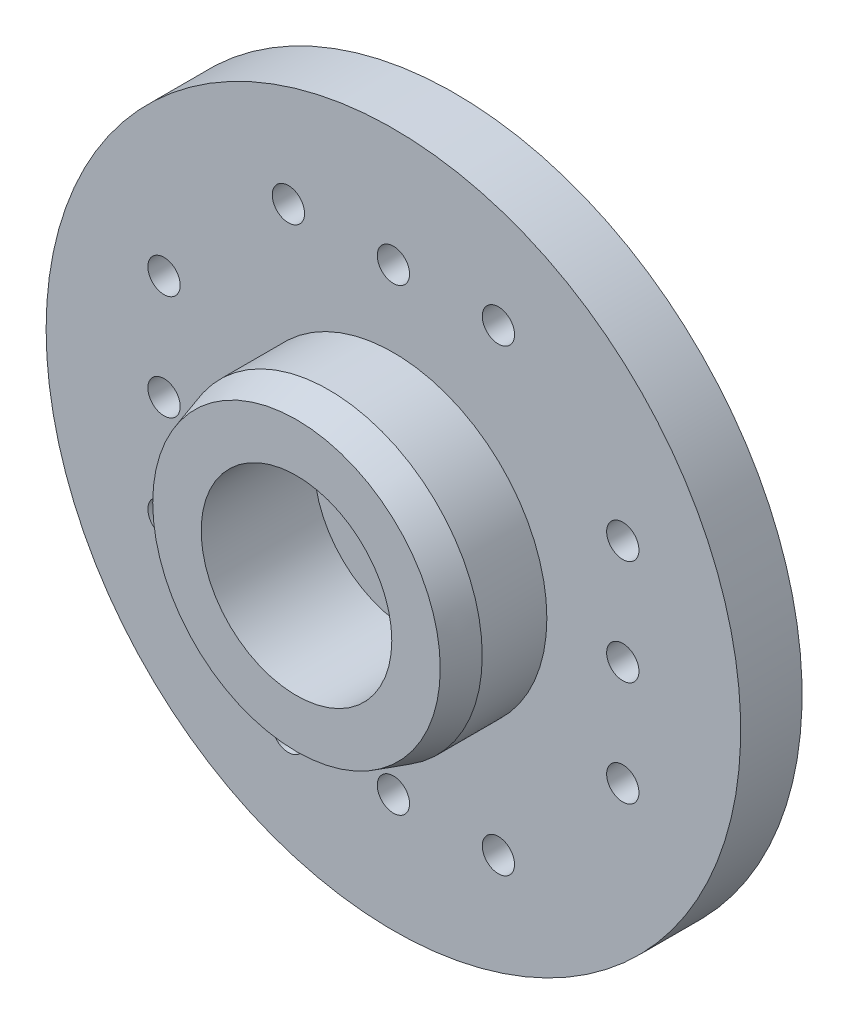
ISO-10303-21;
HEADER;
FILE_DESCRIPTION(('STEP AP214'),'2;1');
FILE_NAME('part.step','',(''),(''),'','','');
FILE_SCHEMA(('AUTOMOTIVE_DESIGN { 1 0 10303 214 1 1 1 1 }'));
ENDSEC;
DATA;
#1=APPLICATION_CONTEXT('core data for automotive mechanical design processes');
#2=APPLICATION_PROTOCOL_DEFINITION('international standard','automotive_design',2000,#1);
#3=PRODUCT_CONTEXT('',#1,'mechanical');
#4=PRODUCT('Part','Part','',(#3));
#5=PRODUCT_RELATED_PRODUCT_CATEGORY('part','',(#4));
#6=PRODUCT_DEFINITION_FORMATION('','',#4);
#7=PRODUCT_DEFINITION_CONTEXT('part definition',#1,'design');
#8=PRODUCT_DEFINITION('design','',#6,#7);
#9=PRODUCT_DEFINITION_SHAPE('','',#8);
#10=(LENGTH_UNIT() NAMED_UNIT(*) SI_UNIT(.MILLI.,.METRE.));
#11=(NAMED_UNIT(*) PLANE_ANGLE_UNIT() SI_UNIT($,.RADIAN.));
#12=(NAMED_UNIT(*) SI_UNIT($,.STERADIAN.) SOLID_ANGLE_UNIT());
#13=UNCERTAINTY_MEASURE_WITH_UNIT(LENGTH_MEASURE(1.E-05),#10,'distance_accuracy_value','');
#14=(GEOMETRIC_REPRESENTATION_CONTEXT(3) GLOBAL_UNCERTAINTY_ASSIGNED_CONTEXT((#13)) GLOBAL_UNIT_ASSIGNED_CONTEXT((#10,
#11,#12)) REPRESENTATION_CONTEXT('',''));
#15=CARTESIAN_POINT('',(0.,0.,0.));
#16=DIRECTION('',(0.,0.,1.));
#17=DIRECTION('',(1.,0.,0.));
#18=AXIS2_PLACEMENT_3D('',#15,#16,#17);
#19=CARTESIAN_POINT('',(0.,0.,0.));
#20=DIRECTION('',(0.,0.,1.));
#21=DIRECTION('',(1.,0.,0.));
#22=AXIS2_PLACEMENT_3D('',#19,#20,#21);
#23=PLANE('',#22);
#24=CARTESIAN_POINT('',(0.,0.,0.));
#25=DIRECTION('',(0.,0.,-1.));
#26=DIRECTION('',(-1.,0.,0.));
#27=AXIS2_PLACEMENT_3D('',#24,#25,#26);
#28=CIRCLE('',#27,4.25);
#29=CARTESIAN_POINT('',(-4.25,0.,0.));
#30=VERTEX_POINT('',#29);
#31=EDGE_CURVE('E142',#30,#30,#28,.T.);
#32=ORIENTED_EDGE('',*,*,#31,.F.);
#33=EDGE_LOOP('',(#32));
#34=FACE_BOUND('',#33,.T.);
#35=CARTESIAN_POINT('',(-7.09999999999931,-5.14309428378815E-13,0.));
#36=DIRECTION('',(0.,0.,1.));
#37=DIRECTION('',(1.,0.,0.));
#38=AXIS2_PLACEMENT_3D('',#35,#36,#37);
#39=CIRCLE('',#38,0.500000000000001);
#40=CARTESIAN_POINT('',(-6.5999999999993,-5.14309428378815E-13,0.));
#41=VERTEX_POINT('',#40);
#42=EDGE_CURVE('E106',#41,#41,#39,.T.);
#43=ORIENTED_EDGE('',*,*,#42,.T.);
#44=EDGE_LOOP('',(#43));
#45=FACE_BOUND('',#44,.T.);
#46=CARTESIAN_POINT('',(-3.24999999999879,-7.09999999999982,0.));
#47=DIRECTION('',(0.,0.,1.));
#48=DIRECTION('',(1.,0.,0.));
#49=AXIS2_PLACEMENT_3D('',#46,#47,#48);
#50=CIRCLE('',#49,0.5);
#51=CARTESIAN_POINT('',(-2.74999999999879,-7.09999999999982,0.));
#52=VERTEX_POINT('',#51);
#53=EDGE_CURVE('E94',#52,#52,#50,.T.);
#54=ORIENTED_EDGE('',*,*,#53,.T.);
#55=EDGE_LOOP('',(#54));
#56=FACE_BOUND('',#55,.T.);
#57=CARTESIAN_POINT('',(3.25000000000121,-7.09999999999982,0.));
#58=DIRECTION('',(0.,0.,1.));
#59=DIRECTION('',(1.,0.,0.));
#60=AXIS2_PLACEMENT_3D('',#57,#58,#59);
#61=CIRCLE('',#60,0.5);
#62=CARTESIAN_POINT('',(3.75000000000121,-7.09999999999982,0.));
#63=VERTEX_POINT('',#62);
#64=EDGE_CURVE('E82',#63,#63,#61,.T.);
#65=ORIENTED_EDGE('',*,*,#64,.T.);
#66=EDGE_LOOP('',(#65));
#67=FACE_BOUND('',#66,.T.);
#68=CARTESIAN_POINT('',(7.10000000000051,6.95585894128985E-13,0.));
#69=DIRECTION('',(0.,0.,1.));
#70=DIRECTION('',(1.,0.,0.));
#71=AXIS2_PLACEMENT_3D('',#68,#69,#70);
#72=CIRCLE('',#71,0.5);
#73=CARTESIAN_POINT('',(7.60000000000051,6.95585894128985E-13,0.));
#74=VERTEX_POINT('',#73);
#75=EDGE_CURVE('E70',#74,#74,#72,.T.);
#76=ORIENTED_EDGE('',*,*,#75,.T.);
#77=EDGE_LOOP('',(#76));
#78=FACE_BOUND('',#77,.T.);
#79=CARTESIAN_POINT('',(3.25,7.1,0.));
#80=DIRECTION('',(0.,0.,1.));
#81=DIRECTION('',(1.,0.,0.));
#82=AXIS2_PLACEMENT_3D('',#79,#80,#81);
#83=CIRCLE('',#82,0.5);
#84=CARTESIAN_POINT('',(3.75,7.1,0.));
#85=VERTEX_POINT('',#84);
#86=EDGE_CURVE('E58',#85,#85,#83,.T.);
#87=ORIENTED_EDGE('',*,*,#86,.T.);
#88=EDGE_LOOP('',(#87));
#89=FACE_BOUND('',#88,.T.);
#90=CARTESIAN_POINT('',(-3.25,7.1,0.));
#91=DIRECTION('',(0.,0.,1.));
#92=DIRECTION('',(1.,0.,0.));
#93=AXIS2_PLACEMENT_3D('',#90,#91,#92);
#94=CIRCLE('',#93,0.5);
#95=CARTESIAN_POINT('',(-2.75,7.1,0.));
#96=VERTEX_POINT('',#95);
#97=EDGE_CURVE('E46',#96,#96,#94,.T.);
#98=ORIENTED_EDGE('',*,*,#97,.T.);
#99=EDGE_LOOP('',(#98));
#100=FACE_BOUND('',#99,.T.);
#101=CARTESIAN_POINT('',(0.,0.,0.));
#102=DIRECTION('',(0.,0.,1.));
#103=DIRECTION('',(1.,0.,0.));
#104=AXIS2_PLACEMENT_3D('',#101,#102,#103);
#105=CIRCLE('',#104,10.75);
#106=CARTESIAN_POINT('',(-10.75,0.,0.));
#107=VERTEX_POINT('',#106);
#108=EDGE_CURVE('E37',#107,#107,#105,.T.);
#109=ORIENTED_EDGE('',*,*,#108,.F.);
#110=EDGE_LOOP('',(#109));
#111=FACE_BOUND('',#110,.T.);
#112=CARTESIAN_POINT('',(0.,7.1,0.));
#113=DIRECTION('',(0.,0.,1.));
#114=DIRECTION('',(1.,0.,0.));
#115=AXIS2_PLACEMENT_3D('',#112,#113,#114);
#116=CIRCLE('',#115,0.5);
#117=CARTESIAN_POINT('',(0.5,7.1,0.));
#118=VERTEX_POINT('',#117);
#119=EDGE_CURVE('E52',#118,#118,#116,.T.);
#120=ORIENTED_EDGE('',*,*,#119,.T.);
#121=EDGE_LOOP('',(#120));
#122=FACE_BOUND('',#121,.T.);
#123=CARTESIAN_POINT('',(7.10000000000051,3.2500000000007,0.));
#124=DIRECTION('',(0.,0.,1.));
#125=DIRECTION('',(1.,0.,0.));
#126=AXIS2_PLACEMENT_3D('',#123,#124,#125);
#127=CIRCLE('',#126,0.500000000000001);
#128=CARTESIAN_POINT('',(7.60000000000051,3.2500000000007,0.));
#129=VERTEX_POINT('',#128);
#130=EDGE_CURVE('E64',#129,#129,#127,.T.);
#131=ORIENTED_EDGE('',*,*,#130,.T.);
#132=EDGE_LOOP('',(#131));
#133=FACE_BOUND('',#132,.T.);
#134=CARTESIAN_POINT('',(7.10000000000051,-3.2499999999993,0.));
#135=DIRECTION('',(0.,0.,1.));
#136=DIRECTION('',(1.,0.,0.));
#137=AXIS2_PLACEMENT_3D('',#134,#135,#136);
#138=CIRCLE('',#137,0.5);
#139=CARTESIAN_POINT('',(7.60000000000051,-3.2499999999993,0.));
#140=VERTEX_POINT('',#139);
#141=EDGE_CURVE('E76',#140,#140,#138,.T.);
#142=ORIENTED_EDGE('',*,*,#141,.T.);
#143=EDGE_LOOP('',(#142));
#144=FACE_BOUND('',#143,.T.);
#145=CARTESIAN_POINT('',(1.20902582328041E-12,-7.09999999999982,0.));
#146=DIRECTION('',(0.,0.,1.));
#147=DIRECTION('',(1.,0.,0.));
#148=AXIS2_PLACEMENT_3D('',#145,#146,#147);
#149=CIRCLE('',#148,0.5);
#150=CARTESIAN_POINT('',(0.500000000001209,-7.09999999999982,0.));
#151=VERTEX_POINT('',#150);
#152=EDGE_CURVE('E88',#151,#151,#149,.T.);
#153=ORIENTED_EDGE('',*,*,#152,.T.);
#154=EDGE_LOOP('',(#153));
#155=FACE_BOUND('',#154,.T.);
#156=CARTESIAN_POINT('',(-7.0999999999993,-3.25000000000051,0.));
#157=DIRECTION('',(0.,0.,1.));
#158=DIRECTION('',(1.,0.,0.));
#159=AXIS2_PLACEMENT_3D('',#156,#157,#158);
#160=CIRCLE('',#159,0.5);
#161=CARTESIAN_POINT('',(-6.5999999999993,-3.25000000000051,0.));
#162=VERTEX_POINT('',#161);
#163=EDGE_CURVE('E100',#162,#162,#160,.T.);
#164=ORIENTED_EDGE('',*,*,#163,.T.);
#165=EDGE_LOOP('',(#164));
#166=FACE_BOUND('',#165,.T.);
#167=CARTESIAN_POINT('',(-7.09999999999931,3.24999999999949,0.));
#168=DIRECTION('',(0.,0.,1.));
#169=DIRECTION('',(1.,0.,0.));
#170=AXIS2_PLACEMENT_3D('',#167,#168,#169);
#171=CIRCLE('',#170,0.500000000000001);
#172=CARTESIAN_POINT('',(-6.59999999999931,3.24999999999949,0.));
#173=VERTEX_POINT('',#172);
#174=EDGE_CURVE('E112',#173,#173,#171,.T.);
#175=ORIENTED_EDGE('',*,*,#174,.T.);
#176=EDGE_LOOP('',(#175));
#177=FACE_BOUND('',#176,.T.);
#178=ADVANCED_FACE('F33',(#34,#45,#56,#67,#78,#89,#100,#111,#122,#133,#144,#155,#166,#177),#23,.F.);
#179=CARTESIAN_POINT('',(0.,0.,1.9));
#180=DIRECTION('',(0.,0.,1.));
#181=DIRECTION('',(1.,0.,0.));
#182=AXIS2_PLACEMENT_3D('',#179,#180,#181);
#183=PLANE('',#182);
#184=CARTESIAN_POINT('',(-7.09999999999931,3.24999999999949,1.9));
#185=DIRECTION('',(0.,0.,1.));
#186=DIRECTION('',(1.,0.,0.));
#187=AXIS2_PLACEMENT_3D('',#184,#185,#186);
#188=CIRCLE('',#187,0.500000000000001);
#189=CARTESIAN_POINT('',(-6.59999999999931,3.24999999999949,1.9));
#190=VERTEX_POINT('',#189);
#191=EDGE_CURVE('E109',#190,#190,#188,.T.);
#192=ORIENTED_EDGE('',*,*,#191,.F.);
#193=EDGE_LOOP('',(#192));
#194=FACE_BOUND('',#193,.T.);
#195=CARTESIAN_POINT('',(-7.0999999999993,-3.25000000000051,1.9));
#196=DIRECTION('',(0.,0.,1.));
#197=DIRECTION('',(1.,0.,0.));
#198=AXIS2_PLACEMENT_3D('',#195,#196,#197);
#199=CIRCLE('',#198,0.5);
#200=CARTESIAN_POINT('',(-6.5999999999993,-3.25000000000051,1.9));
#201=VERTEX_POINT('',#200);
#202=EDGE_CURVE('E97',#201,#201,#199,.T.);
#203=ORIENTED_EDGE('',*,*,#202,.F.);
#204=EDGE_LOOP('',(#203));
#205=FACE_BOUND('',#204,.T.);
#206=CARTESIAN_POINT('',(1.20902582328041E-12,-7.09999999999982,1.9));
#207=DIRECTION('',(0.,0.,1.));
#208=DIRECTION('',(1.,0.,0.));
#209=AXIS2_PLACEMENT_3D('',#206,#207,#208);
#210=CIRCLE('',#209,0.5);
#211=CARTESIAN_POINT('',(0.500000000001209,-7.09999999999982,1.9));
#212=VERTEX_POINT('',#211);
#213=EDGE_CURVE('E85',#212,#212,#210,.T.);
#214=ORIENTED_EDGE('',*,*,#213,.F.);
#215=EDGE_LOOP('',(#214));
#216=FACE_BOUND('',#215,.T.);
#217=CARTESIAN_POINT('',(7.10000000000051,-3.2499999999993,1.9));
#218=DIRECTION('',(0.,0.,1.));
#219=DIRECTION('',(1.,0.,0.));
#220=AXIS2_PLACEMENT_3D('',#217,#218,#219);
#221=CIRCLE('',#220,0.5);
#222=CARTESIAN_POINT('',(7.60000000000051,-3.2499999999993,1.9));
#223=VERTEX_POINT('',#222);
#224=EDGE_CURVE('E73',#223,#223,#221,.T.);
#225=ORIENTED_EDGE('',*,*,#224,.F.);
#226=EDGE_LOOP('',(#225));
#227=FACE_BOUND('',#226,.T.);
#228=CARTESIAN_POINT('',(7.10000000000051,3.2500000000007,1.9));
#229=DIRECTION('',(0.,0.,1.));
#230=DIRECTION('',(1.,0.,0.));
#231=AXIS2_PLACEMENT_3D('',#228,#229,#230);
#232=CIRCLE('',#231,0.500000000000001);
#233=CARTESIAN_POINT('',(7.60000000000051,3.2500000000007,1.9));
#234=VERTEX_POINT('',#233);
#235=EDGE_CURVE('E61',#234,#234,#232,.T.);
#236=ORIENTED_EDGE('',*,*,#235,.F.);
#237=EDGE_LOOP('',(#236));
#238=FACE_BOUND('',#237,.T.);
#239=CARTESIAN_POINT('',(0.,7.1,1.9));
#240=DIRECTION('',(0.,0.,1.));
#241=DIRECTION('',(1.,0.,0.));
#242=AXIS2_PLACEMENT_3D('',#239,#240,#241);
#243=CIRCLE('',#242,0.5);
#244=CARTESIAN_POINT('',(0.5,7.1,1.9));
#245=VERTEX_POINT('',#244);
#246=EDGE_CURVE('E49',#245,#245,#243,.T.);
#247=ORIENTED_EDGE('',*,*,#246,.F.);
#248=EDGE_LOOP('',(#247));
#249=FACE_BOUND('',#248,.T.);
#250=CARTESIAN_POINT('',(0.,0.,1.9));
#251=DIRECTION('',(0.,0.,1.));
#252=DIRECTION('',(1.,0.,0.));
#253=AXIS2_PLACEMENT_3D('',#250,#251,#252);
#254=CIRCLE('',#253,10.75);
#255=CARTESIAN_POINT('',(-10.75,0.,1.9));
#256=VERTEX_POINT('',#255);
#257=EDGE_CURVE('E10',#256,#256,#254,.T.);
#258=ORIENTED_EDGE('',*,*,#257,.T.);
#259=EDGE_LOOP('',(#258));
#260=FACE_BOUND('',#259,.T.);
#261=CARTESIAN_POINT('',(-3.25,7.1,1.9));
#262=DIRECTION('',(0.,0.,1.));
#263=DIRECTION('',(1.,0.,0.));
#264=AXIS2_PLACEMENT_3D('',#261,#262,#263);
#265=CIRCLE('',#264,0.5);
#266=CARTESIAN_POINT('',(-2.75,7.1,1.9));
#267=VERTEX_POINT('',#266);
#268=EDGE_CURVE('E44',#267,#267,#265,.T.);
#269=ORIENTED_EDGE('',*,*,#268,.F.);
#270=EDGE_LOOP('',(#269));
#271=FACE_BOUND('',#270,.T.);
#272=CARTESIAN_POINT('',(3.25,7.1,1.9));
#273=DIRECTION('',(0.,0.,1.));
#274=DIRECTION('',(1.,0.,0.));
#275=AXIS2_PLACEMENT_3D('',#272,#273,#274);
#276=CIRCLE('',#275,0.5);
#277=CARTESIAN_POINT('',(3.75,7.1,1.9));
#278=VERTEX_POINT('',#277);
#279=EDGE_CURVE('E55',#278,#278,#276,.T.);
#280=ORIENTED_EDGE('',*,*,#279,.F.);
#281=EDGE_LOOP('',(#280));
#282=FACE_BOUND('',#281,.T.);
#283=CARTESIAN_POINT('',(7.10000000000051,6.95585894128985E-13,1.9));
#284=DIRECTION('',(0.,0.,1.));
#285=DIRECTION('',(1.,0.,0.));
#286=AXIS2_PLACEMENT_3D('',#283,#284,#285);
#287=CIRCLE('',#286,0.5);
#288=CARTESIAN_POINT('',(7.60000000000051,6.95585894128985E-13,1.9));
#289=VERTEX_POINT('',#288);
#290=EDGE_CURVE('E67',#289,#289,#287,.T.);
#291=ORIENTED_EDGE('',*,*,#290,.F.);
#292=EDGE_LOOP('',(#291));
#293=FACE_BOUND('',#292,.T.);
#294=CARTESIAN_POINT('',(3.25000000000121,-7.09999999999982,1.9));
#295=DIRECTION('',(0.,0.,1.));
#296=DIRECTION('',(1.,0.,0.));
#297=AXIS2_PLACEMENT_3D('',#294,#295,#296);
#298=CIRCLE('',#297,0.5);
#299=CARTESIAN_POINT('',(3.75000000000121,-7.09999999999982,1.9));
#300=VERTEX_POINT('',#299);
#301=EDGE_CURVE('E79',#300,#300,#298,.T.);
#302=ORIENTED_EDGE('',*,*,#301,.F.);
#303=EDGE_LOOP('',(#302));
#304=FACE_BOUND('',#303,.T.);
#305=CARTESIAN_POINT('',(-3.24999999999879,-7.09999999999982,1.9));
#306=DIRECTION('',(0.,0.,1.));
#307=DIRECTION('',(1.,0.,0.));
#308=AXIS2_PLACEMENT_3D('',#305,#306,#307);
#309=CIRCLE('',#308,0.5);
#310=CARTESIAN_POINT('',(-2.74999999999879,-7.09999999999982,1.9));
#311=VERTEX_POINT('',#310);
#312=EDGE_CURVE('E91',#311,#311,#309,.T.);
#313=ORIENTED_EDGE('',*,*,#312,.F.);
#314=EDGE_LOOP('',(#313));
#315=FACE_BOUND('',#314,.T.);
#316=CARTESIAN_POINT('',(-7.09999999999931,-5.14309428378815E-13,1.9));
#317=DIRECTION('',(0.,0.,1.));
#318=DIRECTION('',(1.,0.,0.));
#319=AXIS2_PLACEMENT_3D('',#316,#317,#318);
#320=CIRCLE('',#319,0.500000000000001);
#321=CARTESIAN_POINT('',(-6.5999999999993,-5.14309428378815E-13,1.9));
#322=VERTEX_POINT('',#321);
#323=EDGE_CURVE('E103',#322,#322,#320,.T.);
#324=ORIENTED_EDGE('',*,*,#323,.F.);
#325=EDGE_LOOP('',(#324));
#326=FACE_BOUND('',#325,.T.);
#327=CARTESIAN_POINT('',(0.,0.,1.9));
#328=DIRECTION('',(0.,0.,1.));
#329=DIRECTION('',(1.,0.,0.));
#330=AXIS2_PLACEMENT_3D('',#327,#328,#329);
#331=CIRCLE('',#330,4.75);
#332=CARTESIAN_POINT('',(4.75,0.,1.9));
#333=VERTEX_POINT('',#332);
#334=EDGE_CURVE('E115',#333,#333,#331,.T.);
#335=ORIENTED_EDGE('',*,*,#334,.F.);
#336=EDGE_LOOP('',(#335));
#337=FACE_BOUND('',#336,.T.);
#338=ADVANCED_FACE('F178',(#194,#205,#216,#227,#238,#249,#260,#271,#282,#293,#304,#315,#326,
#337),#183,.T.);
#339=CARTESIAN_POINT('',(0.,0.,1.9));
#340=DIRECTION('',(0.,0.,-1.));
#341=DIRECTION('',(-1.,0.,0.));
#342=AXIS2_PLACEMENT_3D('',#339,#340,#341);
#343=CYLINDRICAL_SURFACE('',#342,10.75);
#344=CARTESIAN_POINT('',(-10.75,0.,1.9));
#345=CARTESIAN_POINT('',(-10.75,0.,1.88020833333333));
#346=CARTESIAN_POINT('',(-10.75,0.,1.86041666666667));
#347=CARTESIAN_POINT('',(-10.75,0.,1.82083333333333));
#348=CARTESIAN_POINT('',(-10.75,0.,1.80104166666667));
#349=CARTESIAN_POINT('',(-10.75,0.,1.76145833333333));
#350=CARTESIAN_POINT('',(-10.75,0.,1.74166666666667));
#351=CARTESIAN_POINT('',(-10.75,0.,1.70208333333333));
#352=CARTESIAN_POINT('',(-10.75,0.,1.68229166666667));
#353=CARTESIAN_POINT('',(-10.75,0.,1.64270833333333));
#354=CARTESIAN_POINT('',(-10.75,0.,1.62291666666667));
#355=CARTESIAN_POINT('',(-10.75,0.,1.58333333333333));
#356=CARTESIAN_POINT('',(-10.75,0.,1.56354166666667));
#357=CARTESIAN_POINT('',(-10.75,0.,1.52395833333333));
#358=CARTESIAN_POINT('',(-10.75,0.,1.50416666666667));
#359=CARTESIAN_POINT('',(-10.75,0.,1.46458333333333));
#360=CARTESIAN_POINT('',(-10.75,0.,1.44479166666667));
#361=CARTESIAN_POINT('',(-10.75,0.,1.40520833333333));
#362=CARTESIAN_POINT('',(-10.75,0.,1.38541666666667));
#363=CARTESIAN_POINT('',(-10.75,0.,1.34583333333333));
#364=CARTESIAN_POINT('',(-10.75,0.,1.32604166666667));
#365=CARTESIAN_POINT('',(-10.75,0.,1.28645833333333));
#366=CARTESIAN_POINT('',(-10.75,0.,1.26666666666667));
#367=CARTESIAN_POINT('',(-10.75,0.,1.22708333333333));
#368=CARTESIAN_POINT('',(-10.75,0.,1.20729166666667));
#369=CARTESIAN_POINT('',(-10.75,0.,1.16770833333333));
#370=CARTESIAN_POINT('',(-10.75,0.,1.14791666666667));
#371=CARTESIAN_POINT('',(-10.75,0.,1.10833333333333));
#372=CARTESIAN_POINT('',(-10.75,0.,1.08854166666667));
#373=CARTESIAN_POINT('',(-10.75,0.,1.04895833333333));
#374=CARTESIAN_POINT('',(-10.75,0.,1.02916666666667));
#375=CARTESIAN_POINT('',(-10.75,0.,0.989583333333333));
#376=CARTESIAN_POINT('',(-10.75,0.,0.969791666666666));
#377=CARTESIAN_POINT('',(-10.75,0.,0.930208333333333));
#378=CARTESIAN_POINT('',(-10.75,0.,0.910416666666667));
#379=CARTESIAN_POINT('',(-10.75,0.,0.870833333333333));
#380=CARTESIAN_POINT('',(-10.75,0.,0.851041666666667));
#381=CARTESIAN_POINT('',(-10.75,0.,0.811458333333333));
#382=CARTESIAN_POINT('',(-10.75,0.,0.791666666666667));
#383=CARTESIAN_POINT('',(-10.75,0.,0.752083333333333));
#384=CARTESIAN_POINT('',(-10.75,0.,0.732291666666667));
#385=CARTESIAN_POINT('',(-10.75,0.,0.692708333333333));
#386=CARTESIAN_POINT('',(-10.75,0.,0.672916666666667));
#387=CARTESIAN_POINT('',(-10.75,0.,0.633333333333333));
#388=CARTESIAN_POINT('',(-10.75,0.,0.613541666666667));
#389=CARTESIAN_POINT('',(-10.75,0.,0.573958333333333));
#390=CARTESIAN_POINT('',(-10.75,0.,0.554166666666667));
#391=CARTESIAN_POINT('',(-10.75,0.,0.514583333333334));
#392=CARTESIAN_POINT('',(-10.75,0.,0.494791666666667));
#393=CARTESIAN_POINT('',(-10.75,0.,0.455208333333333));
#394=CARTESIAN_POINT('',(-10.75,0.,0.435416666666667));
#395=CARTESIAN_POINT('',(-10.75,0.,0.395833333333333));
#396=CARTESIAN_POINT('',(-10.75,0.,0.376041666666667));
#397=CARTESIAN_POINT('',(-10.75,0.,0.336458333333333));
#398=CARTESIAN_POINT('',(-10.75,0.,0.316666666666667));
#399=CARTESIAN_POINT('',(-10.75,0.,0.277083333333333));
#400=CARTESIAN_POINT('',(-10.75,0.,0.257291666666667));
#401=CARTESIAN_POINT('',(-10.75,0.,0.217708333333333));
#402=CARTESIAN_POINT('',(-10.75,0.,0.197916666666667));
#403=CARTESIAN_POINT('',(-10.75,0.,0.158333333333333));
#404=CARTESIAN_POINT('',(-10.75,0.,0.138541666666667));
#405=CARTESIAN_POINT('',(-10.75,0.,0.0989583333333333));
#406=CARTESIAN_POINT('',(-10.75,0.,0.0791666666666666));
#407=CARTESIAN_POINT('',(-10.75,0.,0.0395833333333333));
#408=CARTESIAN_POINT('',(-10.75,0.,0.0197916666666666));
#409=CARTESIAN_POINT('',(-10.75,0.,0.));
#410=B_SPLINE_CURVE_WITH_KNOTS('',3,(#344,#345,#346,#347,#348,#349,#350,#351,#352,#353,#354,
#355,#356,#357,#358,#359,#360,#361,#362,#363,#364,#365,#366,#367,#368,#369,#370,#371,#372,#373,
#374,#375,#376,#377,#378,#379,#380,#381,#382,#383,#384,#385,#386,#387,#388,#389,#390,#391,#392,
#393,#394,#395,#396,#397,#398,#399,#400,#401,#402,#403,#404,#405,#406,#407,#408,#409),
.UNSPECIFIED.,.F.,.F.,(4,2,2,2,2,2,2,2,2,2,2,2,2,2,2,2,2,2,2,2,2,2,2,2,2,2,2,2,2,2,2,2,4),(0.,
0.0593750000000002,0.11875,0.178125,0.2375,0.296875,0.35625,0.415625,0.475,0.534375,0.59375,
0.653125,0.7125,0.771875,0.83125,0.890625,0.95,1.009375,1.06875,1.128125,1.1875,1.246875,
1.30625,1.365625,1.425,1.484375,1.54375,1.603125,1.6625,1.721875,1.78125,1.840625,1.9),.UNSPECIFIED.);
#411=EDGE_CURVE('BSEAM35',#256,#107,#410,.T.);
#412=ORIENTED_EDGE('',*,*,#257,.F.);
#413=ORIENTED_EDGE('',*,*,#108,.T.);
#414=ORIENTED_EDGE('',*,*,#411,.T.);
#415=ORIENTED_EDGE('',*,*,#411,.F.);
#416=EDGE_LOOP('',(#412,#414,#413,#415));
#417=FACE_BOUND('',#416,.T.);
#418=ADVANCED_FACE('F35',(#417),#343,.T.);
#419=CARTESIAN_POINT('',(-3.25,7.1,1.9));
#420=DIRECTION('',(0.,0.,-1.));
#421=DIRECTION('',(-1.,0.,0.));
#422=AXIS2_PLACEMENT_3D('',#419,#420,#421);
#423=CYLINDRICAL_SURFACE('',#422,0.5);
#424=ORIENTED_EDGE('',*,*,#268,.T.);
#425=EDGE_LOOP('',(#424));
#426=FACE_BOUND('',#425,.T.);
#427=ORIENTED_EDGE('',*,*,#97,.F.);
#428=EDGE_LOOP('',(#427));
#429=FACE_BOUND('',#428,.T.);
#430=ADVANCED_FACE('F188',(#426,#429),#423,.F.);
#431=CARTESIAN_POINT('',(0.,7.1,1.9));
#432=DIRECTION('',(0.,0.,-1.));
#433=DIRECTION('',(-1.,0.,0.));
#434=AXIS2_PLACEMENT_3D('',#431,#432,#433);
#435=CYLINDRICAL_SURFACE('',#434,0.5);
#436=ORIENTED_EDGE('',*,*,#246,.T.);
#437=EDGE_LOOP('',(#436));
#438=FACE_BOUND('',#437,.T.);
#439=ORIENTED_EDGE('',*,*,#119,.F.);
#440=EDGE_LOOP('',(#439));
#441=FACE_BOUND('',#440,.T.);
#442=ADVANCED_FACE('F191',(#438,#441),#435,.F.);
#443=CARTESIAN_POINT('',(3.25,7.1,1.9));
#444=DIRECTION('',(0.,0.,-1.));
#445=DIRECTION('',(-1.,0.,0.));
#446=AXIS2_PLACEMENT_3D('',#443,#444,#445);
#447=CYLINDRICAL_SURFACE('',#446,0.5);
#448=ORIENTED_EDGE('',*,*,#279,.T.);
#449=EDGE_LOOP('',(#448));
#450=FACE_BOUND('',#449,.T.);
#451=ORIENTED_EDGE('',*,*,#86,.F.);
#452=EDGE_LOOP('',(#451));
#453=FACE_BOUND('',#452,.T.);
#454=ADVANCED_FACE('F195',(#450,#453),#447,.F.);
#455=CARTESIAN_POINT('',(7.10000000000051,3.2500000000007,1.9));
#456=DIRECTION('',(0.,0.,-1.));
#457=DIRECTION('',(-1.,0.,0.));
#458=AXIS2_PLACEMENT_3D('',#455,#456,#457);
#459=CYLINDRICAL_SURFACE('',#458,0.500000000000001);
#460=ORIENTED_EDGE('',*,*,#235,.T.);
#461=EDGE_LOOP('',(#460));
#462=FACE_BOUND('',#461,.T.);
#463=ORIENTED_EDGE('',*,*,#130,.F.);
#464=EDGE_LOOP('',(#463));
#465=FACE_BOUND('',#464,.T.);
#466=ADVANCED_FACE('F199',(#462,#465),#459,.F.);
#467=CARTESIAN_POINT('',(7.10000000000051,6.95585894128985E-13,1.9));
#468=DIRECTION('',(0.,0.,-1.));
#469=DIRECTION('',(-1.,0.,0.));
#470=AXIS2_PLACEMENT_3D('',#467,#468,#469);
#471=CYLINDRICAL_SURFACE('',#470,0.5);
#472=ORIENTED_EDGE('',*,*,#290,.T.);
#473=EDGE_LOOP('',(#472));
#474=FACE_BOUND('',#473,.T.);
#475=ORIENTED_EDGE('',*,*,#75,.F.);
#476=EDGE_LOOP('',(#475));
#477=FACE_BOUND('',#476,.T.);
#478=ADVANCED_FACE('F203',(#474,#477),#471,.F.);
#479=CARTESIAN_POINT('',(7.10000000000051,-3.2499999999993,1.9));
#480=DIRECTION('',(0.,0.,-1.));
#481=DIRECTION('',(-1.,0.,0.));
#482=AXIS2_PLACEMENT_3D('',#479,#480,#481);
#483=CYLINDRICAL_SURFACE('',#482,0.5);
#484=ORIENTED_EDGE('',*,*,#224,.T.);
#485=EDGE_LOOP('',(#484));
#486=FACE_BOUND('',#485,.T.);
#487=ORIENTED_EDGE('',*,*,#141,.F.);
#488=EDGE_LOOP('',(#487));
#489=FACE_BOUND('',#488,.T.);
#490=ADVANCED_FACE('F207',(#486,#489),#483,.F.);
#491=CARTESIAN_POINT('',(3.25000000000121,-7.09999999999982,1.9));
#492=DIRECTION('',(0.,0.,-1.));
#493=DIRECTION('',(-1.,0.,0.));
#494=AXIS2_PLACEMENT_3D('',#491,#492,#493);
#495=CYLINDRICAL_SURFACE('',#494,0.5);
#496=ORIENTED_EDGE('',*,*,#301,.T.);
#497=EDGE_LOOP('',(#496));
#498=FACE_BOUND('',#497,.T.);
#499=ORIENTED_EDGE('',*,*,#64,.F.);
#500=EDGE_LOOP('',(#499));
#501=FACE_BOUND('',#500,.T.);
#502=ADVANCED_FACE('F211',(#498,#501),#495,.F.);
#503=CARTESIAN_POINT('',(1.20902582328041E-12,-7.09999999999982,1.9));
#504=DIRECTION('',(0.,0.,-1.));
#505=DIRECTION('',(-1.,0.,0.));
#506=AXIS2_PLACEMENT_3D('',#503,#504,#505);
#507=CYLINDRICAL_SURFACE('',#506,0.5);
#508=ORIENTED_EDGE('',*,*,#213,.T.);
#509=EDGE_LOOP('',(#508));
#510=FACE_BOUND('',#509,.T.);
#511=ORIENTED_EDGE('',*,*,#152,.F.);
#512=EDGE_LOOP('',(#511));
#513=FACE_BOUND('',#512,.T.);
#514=ADVANCED_FACE('F215',(#510,#513),#507,.F.);
#515=CARTESIAN_POINT('',(-3.24999999999879,-7.09999999999982,1.9));
#516=DIRECTION('',(0.,0.,-1.));
#517=DIRECTION('',(-1.,0.,0.));
#518=AXIS2_PLACEMENT_3D('',#515,#516,#517);
#519=CYLINDRICAL_SURFACE('',#518,0.5);
#520=ORIENTED_EDGE('',*,*,#312,.T.);
#521=EDGE_LOOP('',(#520));
#522=FACE_BOUND('',#521,.T.);
#523=ORIENTED_EDGE('',*,*,#53,.F.);
#524=EDGE_LOOP('',(#523));
#525=FACE_BOUND('',#524,.T.);
#526=ADVANCED_FACE('F219',(#522,#525),#519,.F.);
#527=CARTESIAN_POINT('',(-7.0999999999993,-3.25000000000051,1.9));
#528=DIRECTION('',(0.,0.,-1.));
#529=DIRECTION('',(-1.,0.,0.));
#530=AXIS2_PLACEMENT_3D('',#527,#528,#529);
#531=CYLINDRICAL_SURFACE('',#530,0.5);
#532=ORIENTED_EDGE('',*,*,#202,.T.);
#533=EDGE_LOOP('',(#532));
#534=FACE_BOUND('',#533,.T.);
#535=ORIENTED_EDGE('',*,*,#163,.F.);
#536=EDGE_LOOP('',(#535));
#537=FACE_BOUND('',#536,.T.);
#538=ADVANCED_FACE('F223',(#534,#537),#531,.F.);
#539=CARTESIAN_POINT('',(-7.09999999999931,-5.14309428378815E-13,1.9));
#540=DIRECTION('',(0.,0.,-1.));
#541=DIRECTION('',(-1.,0.,0.));
#542=AXIS2_PLACEMENT_3D('',#539,#540,#541);
#543=CYLINDRICAL_SURFACE('',#542,0.500000000000001);
#544=ORIENTED_EDGE('',*,*,#323,.T.);
#545=EDGE_LOOP('',(#544));
#546=FACE_BOUND('',#545,.T.);
#547=ORIENTED_EDGE('',*,*,#42,.F.);
#548=EDGE_LOOP('',(#547));
#549=FACE_BOUND('',#548,.T.);
#550=ADVANCED_FACE('F227',(#546,#549),#543,.F.);
#551=CARTESIAN_POINT('',(-7.09999999999931,3.24999999999949,1.9));
#552=DIRECTION('',(0.,0.,-1.));
#553=DIRECTION('',(-1.,0.,0.));
#554=AXIS2_PLACEMENT_3D('',#551,#552,#553);
#555=CYLINDRICAL_SURFACE('',#554,0.500000000000001);
#556=ORIENTED_EDGE('',*,*,#191,.T.);
#557=EDGE_LOOP('',(#556));
#558=FACE_BOUND('',#557,.T.);
#559=ORIENTED_EDGE('',*,*,#174,.F.);
#560=EDGE_LOOP('',(#559));
#561=FACE_BOUND('',#560,.T.);
#562=ADVANCED_FACE('F231',(#558,#561),#555,.F.);
#563=CARTESIAN_POINT('',(0.,0.,4.9));
#564=DIRECTION('',(0.,0.,-1.));
#565=DIRECTION('',(-1.,0.,0.));
#566=AXIS2_PLACEMENT_3D('',#563,#564,#565);
#567=CYLINDRICAL_SURFACE('',#566,4.75);
#568=CARTESIAN_POINT('',(0.,0.,3.9));
#569=DIRECTION('',(0.,0.,1.));
#570=DIRECTION('',(1.,0.,0.));
#571=AXIS2_PLACEMENT_3D('',#568,#569,#570);
#572=CIRCLE('',#571,4.75);
#573=CARTESIAN_POINT('',(4.75,0.,3.9));
#574=VERTEX_POINT('',#573);
#575=EDGE_CURVE('E123',#574,#574,#572,.T.);
#576=ORIENTED_EDGE('',*,*,#575,.F.);
#577=EDGE_LOOP('',(#576));
#578=FACE_BOUND('',#577,.T.);
#579=ORIENTED_EDGE('',*,*,#334,.T.);
#580=EDGE_LOOP('',(#579));
#581=FACE_BOUND('',#580,.T.);
#582=ADVANCED_FACE('F235',(#578,#581),#567,.T.);
#583=CARTESIAN_POINT('',(0.,0.,3.9));
#584=DIRECTION('',(0.,0.,-1.));
#585=DIRECTION('',(-1.,0.,0.));
#586=AXIS2_PLACEMENT_3D('',#583,#584,#585);
#587=CONICAL_SURFACE('',#586,4.75,0.291456794477867);
#588=CARTESIAN_POINT('',(0.,0.,4.9));
#589=DIRECTION('',(0.,0.,1.));
#590=DIRECTION('',(1.,0.,0.));
#591=AXIS2_PLACEMENT_3D('',#588,#589,#590);
#592=CIRCLE('',#591,4.45);
#593=CARTESIAN_POINT('',(4.45,0.,4.9));
#594=VERTEX_POINT('',#593);
#595=EDGE_CURVE('E120',#594,#594,#592,.T.);
#596=ORIENTED_EDGE('',*,*,#595,.F.);
#597=EDGE_LOOP('',(#596));
#598=FACE_BOUND('',#597,.T.);
#599=ORIENTED_EDGE('',*,*,#575,.T.);
#600=EDGE_LOOP('',(#599));
#601=FACE_BOUND('',#600,.T.);
#602=ADVANCED_FACE('F239',(#598,#601),#587,.T.);
#603=CARTESIAN_POINT('',(0.,0.,4.9));
#604=DIRECTION('',(0.,0.,1.));
#605=DIRECTION('',(1.,0.,0.));
#606=AXIS2_PLACEMENT_3D('',#603,#604,#605);
#607=PLANE('',#606);
#608=CARTESIAN_POINT('',(0.,0.,4.9));
#609=DIRECTION('',(0.,0.,1.));
#610=DIRECTION('',(1.,0.,0.));
#611=AXIS2_PLACEMENT_3D('',#608,#609,#610);
#612=CIRCLE('',#611,2.95);
#613=CARTESIAN_POINT('',(2.95,0.,4.9));
#614=VERTEX_POINT('',#613);
#615=EDGE_CURVE('E127',#614,#614,#612,.T.);
#616=ORIENTED_EDGE('',*,*,#615,.F.);
#617=EDGE_LOOP('',(#616));
#618=FACE_BOUND('',#617,.T.);
#619=ORIENTED_EDGE('',*,*,#595,.T.);
#620=EDGE_LOOP('',(#619));
#621=FACE_BOUND('',#620,.T.);
#622=ADVANCED_FACE('F241',(#618,#621),#607,.T.);
#623=CARTESIAN_POINT('',(0.,0.,1.4));
#624=DIRECTION('',(0.,0.,1.));
#625=DIRECTION('',(1.,0.,0.));
#626=AXIS2_PLACEMENT_3D('',#623,#624,#625);
#627=CYLINDRICAL_SURFACE('',#626,2.95);
#628=CARTESIAN_POINT('',(0.,0.,1.4));
#629=DIRECTION('',(0.,0.,1.));
#630=DIRECTION('',(1.,0.,0.));
#631=AXIS2_PLACEMENT_3D('',#628,#629,#630);
#632=CIRCLE('',#631,2.95);
#633=CARTESIAN_POINT('',(2.95,0.,1.4));
#634=VERTEX_POINT('',#633);
#635=EDGE_CURVE('E126',#634,#634,#632,.T.);
#636=ORIENTED_EDGE('',*,*,#635,.F.);
#637=EDGE_LOOP('',(#636));
#638=FACE_BOUND('',#637,.T.);
#639=ORIENTED_EDGE('',*,*,#615,.T.);
#640=EDGE_LOOP('',(#639));
#641=FACE_BOUND('',#640,.T.);
#642=ADVANCED_FACE('F244',(#638,#641),#627,.F.);
#643=CARTESIAN_POINT('',(0.,0.,1.4));
#644=DIRECTION('',(0.,0.,1.));
#645=DIRECTION('',(1.,0.,0.));
#646=AXIS2_PLACEMENT_3D('',#643,#644,#645);
#647=PLANE('',#646);
#648=CARTESIAN_POINT('',(0.,0.,1.4));
#649=DIRECTION('',(0.,0.,1.));
#650=DIRECTION('',(1.,0.,0.));
#651=AXIS2_PLACEMENT_3D('',#648,#649,#650);
#652=CIRCLE('',#651,1.45);
#653=CARTESIAN_POINT('',(1.45,0.,1.4));
#654=VERTEX_POINT('',#653);
#655=EDGE_CURVE('E150',#654,#654,#652,.T.);
#656=ORIENTED_EDGE('',*,*,#655,.F.);
#657=EDGE_LOOP('',(#656));
#658=FACE_BOUND('',#657,.T.);
#659=ORIENTED_EDGE('',*,*,#635,.T.);
#660=EDGE_LOOP('',(#659));
#661=FACE_BOUND('',#660,.T.);
#662=ADVANCED_FACE('F251',(#658,#661),#647,.T.);
#663=CARTESIAN_POINT('',(0.,0.,0.4));
#664=DIRECTION('',(0.,0.,-1.));
#665=DIRECTION('',(-1.,0.,0.));
#666=AXIS2_PLACEMENT_3D('',#663,#664,#665);
#667=CYLINDRICAL_SURFACE('',#666,4.25);
#668=CARTESIAN_POINT('',(0.,0.,0.4));
#669=DIRECTION('',(0.,0.,-1.));
#670=DIRECTION('',(-1.,0.,0.));
#671=AXIS2_PLACEMENT_3D('',#668,#669,#670);
#672=CIRCLE('',#671,4.25);
#673=CARTESIAN_POINT('',(-4.25,0.,0.4));
#674=VERTEX_POINT('',#673);
#675=EDGE_CURVE('E139',#674,#674,#672,.T.);
#676=ORIENTED_EDGE('',*,*,#675,.F.);
#677=EDGE_LOOP('',(#676));
#678=FACE_BOUND('',#677,.T.);
#679=ORIENTED_EDGE('',*,*,#31,.T.);
#680=EDGE_LOOP('',(#679));
#681=FACE_BOUND('',#680,.T.);
#682=ADVANCED_FACE('F255',(#678,#681),#667,.F.);
#683=CARTESIAN_POINT('',(0.,0.,0.4));
#684=DIRECTION('',(0.,0.,-1.));
#685=DIRECTION('',(-1.,0.,0.));
#686=AXIS2_PLACEMENT_3D('',#683,#684,#685);
#687=PLANE('',#686);
#688=CARTESIAN_POINT('',(0.,0.,0.4));
#689=DIRECTION('',(0.,0.,-1.));
#690=DIRECTION('',(-1.,0.,0.));
#691=AXIS2_PLACEMENT_3D('',#688,#689,#690);
#692=CIRCLE('',#691,3.25);
#693=CARTESIAN_POINT('',(-3.25,0.,0.4));
#694=VERTEX_POINT('',#693);
#695=EDGE_CURVE('E145',#694,#694,#692,.T.);
#696=ORIENTED_EDGE('',*,*,#695,.F.);
#697=EDGE_LOOP('',(#696));
#698=FACE_BOUND('',#697,.T.);
#699=ORIENTED_EDGE('',*,*,#675,.T.);
#700=EDGE_LOOP('',(#699));
#701=FACE_BOUND('',#700,.T.);
#702=ADVANCED_FACE('F163',(#698,#701),#687,.T.);
#703=CARTESIAN_POINT('',(0.,0.,0.));
#704=DIRECTION('',(0.,0.,-1.));
#705=DIRECTION('',(-1.,0.,0.));
#706=AXIS2_PLACEMENT_3D('',#703,#704,#705);
#707=CIRCLE('',#706,1.45);
#708=CARTESIAN_POINT('',(-1.45,0.,0.));
#709=VERTEX_POINT('',#708);
#710=EDGE_CURVE('E153',#709,#709,#707,.T.);
#711=ORIENTED_EDGE('',*,*,#710,.F.);
#712=EDGE_LOOP('',(#711));
#713=FACE_BOUND('',#712,.T.);
#714=CARTESIAN_POINT('',(0.,0.,0.));
#715=DIRECTION('',(0.,0.,-1.));
#716=DIRECTION('',(-1.,0.,0.));
#717=AXIS2_PLACEMENT_3D('',#714,#715,#716);
#718=CIRCLE('',#717,2.75);
#719=CARTESIAN_POINT('',(-2.75,0.,0.));
#720=VERTEX_POINT('',#719);
#721=EDGE_CURVE('E136',#720,#720,#718,.T.);
#722=ORIENTED_EDGE('',*,*,#721,.T.);
#723=EDGE_LOOP('',(#722));
#724=FACE_BOUND('',#723,.T.);
#725=ADVANCED_FACE('F159',(#713,#724),#23,.F.);
#726=CARTESIAN_POINT('',(0.,0.,-1.));
#727=DIRECTION('',(0.,0.,1.));
#728=DIRECTION('',(1.,0.,0.));
#729=AXIS2_PLACEMENT_3D('',#726,#727,#728);
#730=CYLINDRICAL_SURFACE('',#729,2.75);
#731=CARTESIAN_POINT('',(0.,0.,-1.));
#732=DIRECTION('',(0.,0.,-1.));
#733=DIRECTION('',(-1.,0.,0.));
#734=AXIS2_PLACEMENT_3D('',#731,#732,#733);
#735=CIRCLE('',#734,2.75);
#736=CARTESIAN_POINT('',(-2.75,0.,-1.));
#737=VERTEX_POINT('',#736);
#738=EDGE_CURVE('E135',#737,#737,#735,.T.);
#739=ORIENTED_EDGE('',*,*,#738,.T.);
#740=EDGE_LOOP('',(#739));
#741=FACE_BOUND('',#740,.T.);
#742=ORIENTED_EDGE('',*,*,#721,.F.);
#743=EDGE_LOOP('',(#742));
#744=FACE_BOUND('',#743,.T.);
#745=ADVANCED_FACE('F162',(#741,#744),#730,.F.);
#746=CARTESIAN_POINT('',(0.,0.,-1.));
#747=DIRECTION('',(0.,0.,-1.));
#748=DIRECTION('',(-1.,0.,0.));
#749=AXIS2_PLACEMENT_3D('',#746,#747,#748);
#750=PLANE('',#749);
#751=CARTESIAN_POINT('',(0.,0.,-1.));
#752=DIRECTION('',(0.,0.,-1.));
#753=DIRECTION('',(-1.,0.,0.));
#754=AXIS2_PLACEMENT_3D('',#751,#752,#753);
#755=CIRCLE('',#754,3.25);
#756=CARTESIAN_POINT('',(-3.25,0.,-1.));
#757=VERTEX_POINT('',#756);
#758=EDGE_CURVE('E130',#757,#757,#755,.T.);
#759=ORIENTED_EDGE('',*,*,#758,.T.);
#760=EDGE_LOOP('',(#759));
#761=FACE_BOUND('',#760,.T.);
#762=ORIENTED_EDGE('',*,*,#738,.F.);
#763=EDGE_LOOP('',(#762));
#764=FACE_BOUND('',#763,.T.);
#765=ADVANCED_FACE('F167',(#761,#764),#750,.T.);
#766=CARTESIAN_POINT('',(0.,0.,-1.));
#767=DIRECTION('',(0.,0.,1.));
#768=DIRECTION('',(1.,0.,0.));
#769=AXIS2_PLACEMENT_3D('',#766,#767,#768);
#770=CYLINDRICAL_SURFACE('',#769,3.25);
#771=ORIENTED_EDGE('',*,*,#758,.F.);
#772=EDGE_LOOP('',(#771));
#773=FACE_BOUND('',#772,.T.);
#774=ORIENTED_EDGE('',*,*,#695,.T.);
#775=EDGE_LOOP('',(#774));
#776=FACE_BOUND('',#775,.T.);
#777=ADVANCED_FACE('F173',(#773,#776),#770,.T.);
#778=CARTESIAN_POINT('',(0.,0.,4.9));
#779=DIRECTION('',(0.,0.,-1.));
#780=DIRECTION('',(-1.,0.,0.));
#781=AXIS2_PLACEMENT_3D('',#778,#779,#780);
#782=CYLINDRICAL_SURFACE('',#781,1.45);
#783=ORIENTED_EDGE('',*,*,#655,.T.);
#784=EDGE_LOOP('',(#783));
#785=FACE_BOUND('',#784,.T.);
#786=ORIENTED_EDGE('',*,*,#710,.T.);
#787=EDGE_LOOP('',(#786));
#788=FACE_BOUND('',#787,.T.);
#789=ADVANCED_FACE('F157',(#785,#788),#782,.F.);
#790=CLOSED_SHELL('',(#178,#338,#418,#430,#442,#454,#466,#478,#490,#502,#514,#526,#538,#550,
#562,#582,#602,#622,#642,#662,#682,#702,#725,#745,#765,#777,#789));
#791=MANIFOLD_SOLID_BREP('B2',#790);
#792=ADVANCED_BREP_SHAPE_REPRESENTATION('',(#18,#791),#14);
#793=SHAPE_DEFINITION_REPRESENTATION(#9,#792);
ENDSEC;
END-ISO-10303-21;
